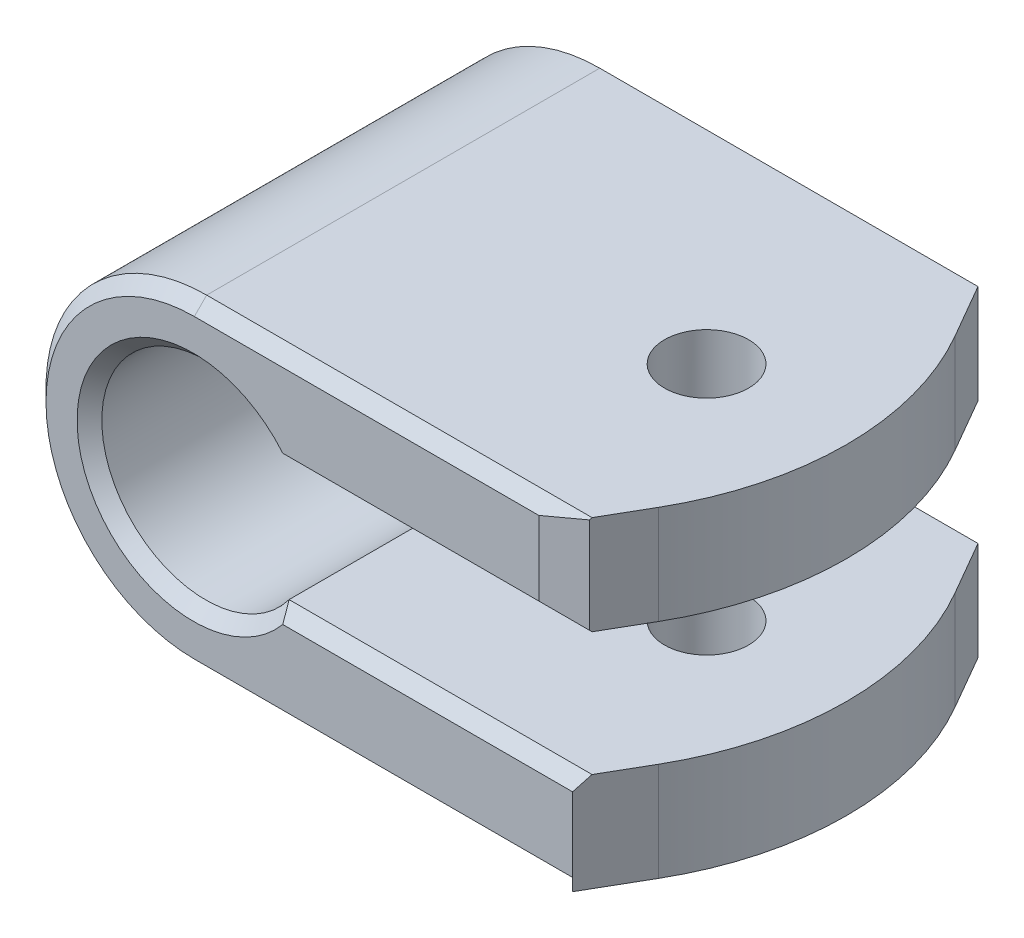
ISO-10303-21;
HEADER;
FILE_DESCRIPTION(('STEP AP214'),'2;1');
FILE_NAME('part.step','',(''),(''),'','','');
FILE_SCHEMA(('AUTOMOTIVE_DESIGN { 1 0 10303 214 1 1 1 1 }'));
ENDSEC;
DATA;
#1=APPLICATION_CONTEXT('core data for automotive mechanical design processes');
#2=APPLICATION_PROTOCOL_DEFINITION('international standard','automotive_design',2000,#1);
#3=PRODUCT_CONTEXT('',#1,'mechanical');
#4=PRODUCT('Part','Part','',(#3));
#5=PRODUCT_RELATED_PRODUCT_CATEGORY('part','',(#4));
#6=PRODUCT_DEFINITION_FORMATION('','',#4);
#7=PRODUCT_DEFINITION_CONTEXT('part definition',#1,'design');
#8=PRODUCT_DEFINITION('design','',#6,#7);
#9=PRODUCT_DEFINITION_SHAPE('','',#8);
#10=(LENGTH_UNIT() NAMED_UNIT(*) SI_UNIT(.MILLI.,.METRE.));
#11=(NAMED_UNIT(*) PLANE_ANGLE_UNIT() SI_UNIT($,.RADIAN.));
#12=(NAMED_UNIT(*) SI_UNIT($,.STERADIAN.) SOLID_ANGLE_UNIT());
#13=UNCERTAINTY_MEASURE_WITH_UNIT(LENGTH_MEASURE(1.E-05),#10,'distance_accuracy_value','');
#14=(GEOMETRIC_REPRESENTATION_CONTEXT(3) GLOBAL_UNCERTAINTY_ASSIGNED_CONTEXT((#13)) GLOBAL_UNIT_ASSIGNED_CONTEXT((#10,
#11,#12)) REPRESENTATION_CONTEXT('',''));
#15=CARTESIAN_POINT('',(0.,0.,0.));
#16=DIRECTION('',(0.,0.,1.));
#17=DIRECTION('',(1.,0.,0.));
#18=AXIS2_PLACEMENT_3D('',#15,#16,#17);
#19=CARTESIAN_POINT('',(7.20000000000028,1.4,-1.00613961606655E-13));
#20=DIRECTION('',(0.,-1.,0.));
#21=DIRECTION('',(1.,0.,0.));
#22=AXIS2_PLACEMENT_3D('',#19,#20,#21);
#23=PLANE('',#22);
#24=DIRECTION('',(0.500000292604391,0.,0.866025234849149));
#25=VECTOR('',#24,1.);
#26=CARTESIAN_POINT('',(15.4826863436423,1.4,-8.93894010313866));
#27=LINE('',#26,#25);
#28=CARTESIAN_POINT('',(22.5489306660471,1.4,3.30014453206585));
#29=VERTEX_POINT('',#28);
#30=CARTESIAN_POINT('',(25.3778646431267,1.4,8.19999808837436));
#31=VERTEX_POINT('',#30);
#32=EDGE_CURVE('E236',#29,#31,#27,.T.);
#33=ORIENTED_EDGE('',*,*,#32,.F.);
#34=DIRECTION('',(0.999999999999943,0.,-3.37870480659489E-07));
#35=VECTOR('',#34,1.);
#36=CARTESIAN_POINT('',(1.11502399338512E-06,1.4,3.30015215068352));
#37=LINE('',#36,#35);
#38=CARTESIAN_POINT('',(16.8910660229206,1.4,3.3001464436913));
#39=VERTEX_POINT('',#38);
#40=EDGE_CURVE('E232',#39,#29,#37,.T.);
#41=ORIENTED_EDGE('',*,*,#40,.F.);
#42=DIRECTION('',(0.499999707395552,0.,-0.86602557271963));
#43=VECTOR('',#42,1.);
#44=CARTESIAN_POINT('',(14.0973092303015,1.4,8.13907892821232));
#45=LINE('',#44,#43);
#46=CARTESIAN_POINT('',(14.0621353568735,1.4,8.20000191162539));
#47=VERTEX_POINT('',#46);
#48=EDGE_CURVE('E216',#47,#39,#45,.T.);
#49=ORIENTED_EDGE('',*,*,#48,.F.);
#50=DIRECTION('',(-0.500000292604391,0.,-0.866025234849149));
#51=VECTOR('',#50,1.);
#52=CARTESIAN_POINT('',(6.99589103446863,1.4,-4.03908272357912));
#53=LINE('',#52,#51);
#54=CARTESIAN_POINT('',(16.891069333953,1.4,13.099855467934));
#55=VERTEX_POINT('',#54);
#56=EDGE_CURVE('E250',#55,#47,#53,.T.);
#57=ORIENTED_EDGE('',*,*,#56,.F.);
#58=DIRECTION('',(-0.999999999999943,0.,3.37870480659488E-07));
#59=VECTOR('',#58,1.);
#60=CARTESIAN_POINT('',(4.42605639172933E-06,1.4,13.0998611749263));
#61=LINE('',#60,#59);
#62=CARTESIAN_POINT('',(22.5489339770795,1.4,13.0998535563086));
#63=VERTEX_POINT('',#62);
#64=EDGE_CURVE('E247',#63,#55,#61,.T.);
#65=ORIENTED_EDGE('',*,*,#64,.F.);
#66=DIRECTION('',(-0.499999707395552,0.,0.86602557271963));
#67=VECTOR('',#66,1.);
#68=CARTESIAN_POINT('',(22.5841078505075,1.4,13.0389305728955));
#69=LINE('',#68,#67);
#70=EDGE_CURVE('E244',#31,#63,#69,.T.);
#71=ORIENTED_EDGE('',*,*,#70,.F.);
#72=CARTESIAN_POINT('',(13.3778646431267,1.4,8.19999808837445));
#73=DIRECTION('',(0.,-1.,0.));
#74=DIRECTION('',(1.,0.,0.));
#75=AXIS2_PLACEMENT_3D('',#72,#73,#74);
#76=CIRCLE('',#75,12.);
#77=CARTESIAN_POINT('',(23.7701694885399,1.39999999999967,14.1999980883743));
#78=VERTEX_POINT('',#77);
#79=EDGE_CURVE('E854',#31,#78,#76,.T.);
#80=ORIENTED_EDGE('',*,*,#79,.T.);
#81=DIRECTION('',(0.499999999999994,0.,-0.866025403784442));
#82=VECTOR('',#81,1.);
#83=CARTESIAN_POINT('',(22.5000000000002,1.39999999999969,16.399996176749));
#84=LINE('',#83,#82);
#85=CARTESIAN_POINT('',(22.5000000000002,1.39999999999969,16.399996176749));
#86=VERTEX_POINT('',#85);
#87=EDGE_CURVE('E280',#86,#78,#84,.T.);
#88=ORIENTED_EDGE('',*,*,#87,.F.);
#89=DIRECTION('',(0.,0.,1.));
#90=VECTOR('',#89,1.);
#91=CARTESIAN_POINT('',(22.5000000000002,1.39999999999969,-1.00613961606655E-13));
#92=LINE('',#91,#90);
#93=CARTESIAN_POINT('',(22.5000000000003,1.4,15.899996176749));
#94=VERTEX_POINT('',#93);
#95=EDGE_CURVE('E276',#94,#86,#92,.T.);
#96=ORIENTED_EDGE('',*,*,#95,.F.);
#97=DIRECTION('',(-1.,0.,0.));
#98=VECTOR('',#97,1.);
#99=CARTESIAN_POINT('',(7.20000000000028,1.4,15.899996176749));
#100=LINE('',#99,#98);
#101=CARTESIAN_POINT('',(7.20000000000028,1.4,15.899996176749));
#102=VERTEX_POINT('',#101);
#103=EDGE_CURVE('E378',#94,#102,#100,.T.);
#104=ORIENTED_EDGE('',*,*,#103,.T.);
#105=DIRECTION('',(0.,0.,1.));
#106=VECTOR('',#105,1.);
#107=CARTESIAN_POINT('',(7.20000000000028,1.4,-1.00613961606655E-13));
#108=LINE('',#107,#106);
#109=CARTESIAN_POINT('',(7.20000000000028,1.4,-1.00613961606655E-13));
#110=VERTEX_POINT('',#109);
#111=EDGE_CURVE('E328',#110,#102,#108,.T.);
#112=ORIENTED_EDGE('',*,*,#111,.F.);
#113=DIRECTION('',(1.,0.,0.));
#114=VECTOR('',#113,1.);
#115=CARTESIAN_POINT('',(7.20000000000028,1.4,-1.00613961606655E-13));
#116=LINE('',#115,#114);
#117=CARTESIAN_POINT('',(22.5000000000003,1.4,-1.00613961606655E-13));
#118=VERTEX_POINT('',#117);
#119=EDGE_CURVE('E318',#110,#118,#116,.T.);
#120=ORIENTED_EDGE('',*,*,#119,.T.);
#121=DIRECTION('',(-0.499999999999994,0.,-0.866025403784442));
#122=VECTOR('',#121,1.);
#123=CARTESIAN_POINT('',(27.2342711036776,1.39999999999962,8.19999808837445));
#124=LINE('',#123,#122);
#125=CARTESIAN_POINT('',(23.7701694885399,1.39999999999967,2.19999808837456));
#126=VERTEX_POINT('',#125);
#127=EDGE_CURVE('E275',#126,#118,#124,.T.);
#128=ORIENTED_EDGE('',*,*,#127,.F.);
#129=EDGE_CURVE('E830',#126,#31,#76,.T.);
#130=ORIENTED_EDGE('',*,*,#129,.T.);
#131=EDGE_LOOP('',(#33,#41,#49,#57,#65,#71,#80,#88,#96,#104,#112,#120,#128,#130));
#132=FACE_BOUND('',#131,.T.);
#133=ADVANCED_FACE('F34',(#132),#23,.T.);
#134=CARTESIAN_POINT('',(27.2342711036777,-6.66965721625649,8.19999808837445));
#135=DIRECTION('',(0.866025403784442,0.,-0.499999999999994));
#136=DIRECTION('',(-0.499999999999995,0.,-0.866025403784442));
#137=AXIS2_PLACEMENT_3D('',#134,#135,#136);
#138=PLANE('',#137);
#139=DIRECTION('',(0.499999999999995,0.,0.866025403784442));
#140=VECTOR('',#139,1.);
#141=CARTESIAN_POINT('',(27.2342711036777,10.4,8.19999808837456));
#142=LINE('',#141,#140);
#143=CARTESIAN_POINT('',(22.5000000000003,10.4000000000001,-1.00613961606655E-13));
#144=VERTEX_POINT('',#143);
#145=CARTESIAN_POINT('',(23.77016948854,10.4000000000001,2.19999808837452));
#146=VERTEX_POINT('',#145);
#147=EDGE_CURVE('E268',#144,#146,#142,.T.);
#148=ORIENTED_EDGE('',*,*,#147,.F.);
#149=DIRECTION('',(0.,1.,0.));
#150=VECTOR('',#149,1.);
#151=CARTESIAN_POINT('',(22.5000000000003,1.4,-1.00613961606655E-13));
#152=LINE('',#151,#150);
#153=CARTESIAN_POINT('',(22.5000000000003,14.4,-1.00613961606655E-13));
#154=VERTEX_POINT('',#153);
#155=EDGE_CURVE('E321',#144,#154,#152,.T.);
#156=ORIENTED_EDGE('',*,*,#155,.T.);
#157=DIRECTION('',(-0.499999999999994,0.,-0.866025403784442));
#158=VECTOR('',#157,1.);
#159=CARTESIAN_POINT('',(27.2342711036777,14.4,8.19999808837445));
#160=LINE('',#159,#158);
#161=CARTESIAN_POINT('',(23.77016948854,14.4,2.19999808837452));
#162=VERTEX_POINT('',#161);
#163=EDGE_CURVE('E286',#162,#154,#160,.T.);
#164=ORIENTED_EDGE('',*,*,#163,.F.);
#165=DIRECTION('',(0.,1.,0.));
#166=VECTOR('',#165,1.);
#167=CARTESIAN_POINT('',(23.77016948854,-6.66965721625649,2.19999808837452));
#168=LINE('',#167,#166);
#169=EDGE_CURVE('E343',#162,#146,#168,.F.);
#170=ORIENTED_EDGE('',*,*,#169,.T.);
#171=EDGE_LOOP('',(#148,#156,#164,#170));
#172=FACE_BOUND('',#171,.T.);
#173=ADVANCED_FACE('F441',(#172),#138,.T.);
#174=CARTESIAN_POINT('',(22.5000000000003,-6.66965721625649,16.399996176749));
#175=DIRECTION('',(0.866025403784442,0.,0.499999999999994));
#176=DIRECTION('',(0.499999999999995,0.,-0.866025403784442));
#177=AXIS2_PLACEMENT_3D('',#174,#175,#176);
#178=PLANE('',#177);
#179=DIRECTION('',(-0.499999999999995,0.,0.866025403784442));
#180=VECTOR('',#179,1.);
#181=CARTESIAN_POINT('',(22.5000000000003,10.4000000000001,16.3999961767489));
#182=LINE('',#181,#180);
#183=CARTESIAN_POINT('',(23.77016948854,10.4000000000001,14.1999980883744));
#184=VERTEX_POINT('',#183);
#185=CARTESIAN_POINT('',(22.7886751345951,10.4000000000001,15.899996176749));
#186=VERTEX_POINT('',#185);
#187=EDGE_CURVE('E270',#184,#186,#182,.T.);
#188=ORIENTED_EDGE('',*,*,#187,.F.);
#189=DIRECTION('',(0.,1.,0.));
#190=VECTOR('',#189,1.);
#191=CARTESIAN_POINT('',(23.77016948854,-6.66965721625649,14.1999980883744));
#192=LINE('',#191,#190);
#193=CARTESIAN_POINT('',(23.77016948854,14.4,14.1999980883744));
#194=VERTEX_POINT('',#193);
#195=EDGE_CURVE('E334',#184,#194,#192,.T.);
#196=ORIENTED_EDGE('',*,*,#195,.T.);
#197=DIRECTION('',(0.499999999999994,0.,-0.866025403784442));
#198=VECTOR('',#197,1.);
#199=CARTESIAN_POINT('',(22.5000000000003,14.4,16.399996176749));
#200=LINE('',#199,#198);
#201=CARTESIAN_POINT('',(22.7886751345951,14.4,15.899996176749));
#202=VERTEX_POINT('',#201);
#203=EDGE_CURVE('E288',#202,#194,#200,.T.);
#204=ORIENTED_EDGE('',*,*,#203,.F.);
#205=DIRECTION('',(0.377964473009222,0.654653670707979,-0.654653670707979));
#206=VECTOR('',#205,1.);
#207=CARTESIAN_POINT('',(17.4103298010243,5.08443262160433,25.2155635551447));
#208=LINE('',#207,#206);
#209=CARTESIAN_POINT('',(22.7500000000003,14.3330127018922,15.9669834748568));
#210=VERTEX_POINT('',#209);
#211=EDGE_CURVE('E373',#202,#210,#208,.F.);
#212=ORIENTED_EDGE('',*,*,#211,.T.);
#213=DIRECTION('',(0.,-1.,0.));
#214=VECTOR('',#213,1.);
#215=CARTESIAN_POINT('',(22.7500000000003,-6.66965721625649,15.9669834748568));
#216=LINE('',#215,#214);
#217=CARTESIAN_POINT('',(22.7500000000003,10.4669872981079,15.9669834748568));
#218=VERTEX_POINT('',#217);
#219=EDGE_CURVE('E371',#210,#218,#216,.T.);
#220=ORIENTED_EDGE('',*,*,#219,.T.);
#221=DIRECTION('',(0.377964473009223,-0.654653670707978,-0.654653670707979));
#222=VECTOR('',#221,1.);
#223=CARTESIAN_POINT('',(26.8473627100182,3.37014690731867,8.87014308406759));
#224=LINE('',#223,#222);
#225=EDGE_CURVE('E368',#218,#186,#224,.T.);
#226=ORIENTED_EDGE('',*,*,#225,.T.);
#227=EDGE_LOOP('',(#188,#196,#204,#212,#220,#226));
#228=FACE_BOUND('',#227,.T.);
#229=ADVANCED_FACE('F447',(#228),#178,.T.);
#230=CARTESIAN_POINT('',(10.53268810596,10.4000000000001,16.399996176749));
#231=DIRECTION('',(0.,1.,0.));
#232=DIRECTION('',(-1.,0.,0.));
#233=AXIS2_PLACEMENT_3D('',#230,#231,#232);
#234=PLANE('',#233);
#235=CARTESIAN_POINT('',(19.7200000000002,10.4000000000001,8.19999999999995));
#236=DIRECTION('',(0.,1.,0.));
#237=DIRECTION('',(-1.,0.,0.));
#238=AXIS2_PLACEMENT_3D('',#235,#236,#237);
#239=CIRCLE('',#238,1.7);
#240=CARTESIAN_POINT('',(18.0200000000002,10.4000000000001,8.19999999999995));
#241=VERTEX_POINT('',#240);
#242=EDGE_CURVE('E298',#241,#241,#239,.T.);
#243=ORIENTED_EDGE('',*,*,#242,.T.);
#244=EDGE_LOOP('',(#243));
#245=FACE_BOUND('',#244,.T.);
#246=DIRECTION('',(1.,0.,0.));
#247=VECTOR('',#246,1.);
#248=CARTESIAN_POINT('',(10.53268810596,10.4000000000001,0.));
#249=LINE('',#248,#247);
#250=CARTESIAN_POINT('',(10.53268810596,10.4000000000001,0.));
#251=VERTEX_POINT('',#250);
#252=EDGE_CURVE('E301',#251,#144,#249,.T.);
#253=ORIENTED_EDGE('',*,*,#252,.T.);
#254=ORIENTED_EDGE('',*,*,#147,.T.);
#255=CARTESIAN_POINT('',(13.3778646431267,10.4000000000001,8.19999808837445));
#256=DIRECTION('',(0.,1.,0.));
#257=DIRECTION('',(-1.,0.,0.));
#258=AXIS2_PLACEMENT_3D('',#255,#256,#257);
#259=CIRCLE('',#258,12.);
#260=EDGE_CURVE('E346',#146,#184,#259,.F.);
#261=ORIENTED_EDGE('',*,*,#260,.T.);
#262=ORIENTED_EDGE('',*,*,#187,.T.);
#263=DIRECTION('',(-1.,0.,0.));
#264=VECTOR('',#263,1.);
#265=CARTESIAN_POINT('',(11.1377304482492,10.4000000000001,15.899996176749));
#266=LINE('',#265,#264);
#267=CARTESIAN_POINT('',(10.53268810596,10.4000000000001,15.899996176749));
#268=VERTEX_POINT('',#267);
#269=EDGE_CURVE('E384',#186,#268,#266,.T.);
#270=ORIENTED_EDGE('',*,*,#269,.T.);
#271=DIRECTION('',(0.,0.,-1.));
#272=VECTOR('',#271,1.);
#273=CARTESIAN_POINT('',(10.53268810596,10.4000000000001,16.399996176749));
#274=LINE('',#273,#272);
#275=EDGE_CURVE('E311',#268,#251,#274,.T.);
#276=ORIENTED_EDGE('',*,*,#275,.T.);
#277=EDGE_LOOP('',(#253,#254,#261,#262,#270,#276));
#278=FACE_BOUND('',#277,.T.);
#279=ADVANCED_FACE('F469',(#245,#278),#234,.F.);
#280=CARTESIAN_POINT('',(7.20000000000028,7.9,-1.00613961606655E-13));
#281=DIRECTION('',(0.,0.,1.));
#282=DIRECTION('',(1.,0.,0.));
#283=AXIS2_PLACEMENT_3D('',#280,#281,#282);
#284=CYLINDRICAL_SURFACE('',#283,6.5);
#285=ORIENTED_EDGE('',*,*,#111,.T.);
#286=CARTESIAN_POINT('',(7.20000000000028,7.9,15.899996176749));
#287=DIRECTION('',(0.,0.,1.));
#288=DIRECTION('',(1.,0.,0.));
#289=AXIS2_PLACEMENT_3D('',#286,#287,#288);
#290=CIRCLE('',#289,6.5);
#291=CARTESIAN_POINT('',(7.20000000000028,14.4,15.899996176749));
#292=VERTEX_POINT('',#291);
#293=EDGE_CURVE('E380',#102,#292,#290,.F.);
#294=ORIENTED_EDGE('',*,*,#293,.T.);
#295=DIRECTION('',(0.,0.,1.));
#296=VECTOR('',#295,1.);
#297=CARTESIAN_POINT('',(7.20000000000028,14.4,-1.00613961606655E-13));
#298=LINE('',#297,#296);
#299=CARTESIAN_POINT('',(7.20000000000028,14.4,-1.00613961606655E-13));
#300=VERTEX_POINT('',#299);
#301=EDGE_CURVE('E331',#300,#292,#298,.T.);
#302=ORIENTED_EDGE('',*,*,#301,.F.);
#303=CARTESIAN_POINT('',(7.20000000000028,7.9,-1.00613961606655E-13));
#304=DIRECTION('',(0.,0.,1.));
#305=DIRECTION('',(1.,0.,0.));
#306=AXIS2_PLACEMENT_3D('',#303,#304,#305);
#307=CIRCLE('',#306,6.5);
#308=EDGE_CURVE('E315',#300,#110,#307,.T.);
#309=ORIENTED_EDGE('',*,*,#308,.T.);
#310=EDGE_LOOP('',(#285,#294,#302,#309));
#311=FACE_BOUND('',#310,.T.);
#312=ADVANCED_FACE('F464',(#311),#284,.T.);
#313=CARTESIAN_POINT('',(22.5000000000003,14.4,-1.00613961606655E-13));
#314=DIRECTION('',(0.,1.,0.));
#315=DIRECTION('',(0.,0.,1.));
#316=AXIS2_PLACEMENT_3D('',#313,#314,#315);
#317=PLANE('',#316);
#318=CARTESIAN_POINT('',(19.7200000000002,14.4,8.19999999999995));
#319=DIRECTION('',(0.,-1.,0.));
#320=DIRECTION('',(1.,0.,0.));
#321=AXIS2_PLACEMENT_3D('',#318,#319,#320);
#322=CIRCLE('',#321,1.7);
#323=CARTESIAN_POINT('',(21.4200000000002,14.4,8.19999999999995));
#324=VERTEX_POINT('',#323);
#325=EDGE_CURVE('E294',#324,#324,#322,.T.);
#326=ORIENTED_EDGE('',*,*,#325,.T.);
#327=EDGE_LOOP('',(#326));
#328=FACE_BOUND('',#327,.T.);
#329=ORIENTED_EDGE('',*,*,#301,.T.);
#330=DIRECTION('',(1.,0.,0.));
#331=VECTOR('',#330,1.);
#332=CARTESIAN_POINT('',(22.5000000000003,14.4,15.899996176749));
#333=LINE('',#332,#331);
#334=EDGE_CURVE('E382',#292,#202,#333,.T.);
#335=ORIENTED_EDGE('',*,*,#334,.T.);
#336=ORIENTED_EDGE('',*,*,#203,.T.);
#337=CARTESIAN_POINT('',(13.3778646431267,14.4,8.19999808837445));
#338=DIRECTION('',(0.,1.,0.));
#339=DIRECTION('',(0.,0.,1.));
#340=AXIS2_PLACEMENT_3D('',#337,#338,#339);
#341=CIRCLE('',#340,12.);
#342=EDGE_CURVE('E341',#194,#162,#341,.T.);
#343=ORIENTED_EDGE('',*,*,#342,.T.);
#344=ORIENTED_EDGE('',*,*,#163,.T.);
#345=DIRECTION('',(-1.,0.,0.));
#346=VECTOR('',#345,1.);
#347=CARTESIAN_POINT('',(22.5000000000003,14.4,-1.00613961606655E-13));
#348=LINE('',#347,#346);
#349=EDGE_CURVE('E325',#154,#300,#348,.T.);
#350=ORIENTED_EDGE('',*,*,#349,.T.);
#351=EDGE_LOOP('',(#329,#335,#336,#343,#344,#350));
#352=FACE_BOUND('',#351,.T.);
#353=ADVANCED_FACE('F456',(#328,#352),#317,.T.);
#354=DIRECTION('',(-1.,0.,0.));
#355=VECTOR('',#354,1.);
#356=CARTESIAN_POINT('',(0.,1.4,10.9712812921102));
#357=LINE('',#356,#355);
#358=CARTESIAN_POINT('',(21.3200000000001,1.4,10.9712812921102));
#359=VERTEX_POINT('',#358);
#360=CARTESIAN_POINT('',(18.1200000000001,1.4,10.9712812921101));
#361=VERTEX_POINT('',#360);
#362=EDGE_CURVE('E211',#359,#361,#357,.T.);
#363=ORIENTED_EDGE('',*,*,#362,.T.);
#364=DIRECTION('',(-0.5,0.,-0.866025403784439));
#365=VECTOR('',#364,1.);
#366=CARTESIAN_POINT('',(8.83929584448388,1.4,-5.10336983525951));
#367=LINE('',#366,#365);
#368=CARTESIAN_POINT('',(16.5200000000001,1.4,8.19999999999994));
#369=VERTEX_POINT('',#368);
#370=EDGE_CURVE('E224',#361,#369,#367,.T.);
#371=ORIENTED_EDGE('',*,*,#370,.T.);
#372=DIRECTION('',(0.500000000000001,0.,-0.866025403784438));
#373=VECTOR('',#372,1.);
#374=CARTESIAN_POINT('',(15.9407041555162,1.4,9.20336983525949));
#375=LINE('',#374,#373);
#376=CARTESIAN_POINT('',(18.1200000000001,1.4,5.42871870788973));
#377=VERTEX_POINT('',#376);
#378=EDGE_CURVE('E233',#369,#377,#375,.T.);
#379=ORIENTED_EDGE('',*,*,#378,.T.);
#380=DIRECTION('',(1.,0.,0.));
#381=VECTOR('',#380,1.);
#382=CARTESIAN_POINT('',(0.,1.4,5.42871870788973));
#383=LINE('',#382,#381);
#384=CARTESIAN_POINT('',(21.3200000000001,1.4,5.42871870788973));
#385=VERTEX_POINT('',#384);
#386=EDGE_CURVE('E238',#377,#385,#383,.T.);
#387=ORIENTED_EDGE('',*,*,#386,.T.);
#388=DIRECTION('',(0.5,0.,0.866025403784439));
#389=VECTOR('',#388,1.);
#390=CARTESIAN_POINT('',(13.6392958444839,1.4,-7.87465112736971));
#391=LINE('',#390,#389);
#392=CARTESIAN_POINT('',(22.9200000000001,1.4,8.19999999999994));
#393=VERTEX_POINT('',#392);
#394=EDGE_CURVE('E896',#385,#393,#391,.T.);
#395=ORIENTED_EDGE('',*,*,#394,.T.);
#396=DIRECTION('',(-0.500000000000001,0.,0.866025403784438));
#397=VECTOR('',#396,1.);
#398=CARTESIAN_POINT('',(20.7407041555162,1.4,11.9746511273697));
#399=LINE('',#398,#397);
#400=EDGE_CURVE('E228',#393,#359,#399,.T.);
#401=ORIENTED_EDGE('',*,*,#400,.T.);
#402=EDGE_LOOP('',(#363,#371,#379,#387,#395,#401));
#403=FACE_BOUND('',#402,.T.);
#404=CARTESIAN_POINT('',(19.7200000000001,1.39999999999973,8.19999999999995));
#405=DIRECTION('',(0.,-1.,0.));
#406=DIRECTION('',(1.,0.,0.));
#407=AXIS2_PLACEMENT_3D('',#404,#405,#406);
#408=CIRCLE('',#407,1.7);
#409=CARTESIAN_POINT('',(21.4200000000001,1.3999999999997,8.19999999999995));
#410=VERTEX_POINT('',#409);
#411=EDGE_CURVE('E291',#410,#410,#408,.T.);
#412=ORIENTED_EDGE('',*,*,#411,.F.);
#413=EDGE_LOOP('',(#412));
#414=FACE_BOUND('',#413,.T.);
#415=ADVANCED_FACE('F221',(#403,#414),#23,.T.);
#416=CARTESIAN_POINT('',(7.20000000000028,7.9,-1.00613961606655E-13));
#417=DIRECTION('',(0.,0.,1.));
#418=DIRECTION('',(1.,0.,0.));
#419=AXIS2_PLACEMENT_3D('',#416,#417,#418);
#420=PLANE('',#419);
#421=ORIENTED_EDGE('',*,*,#155,.F.);
#422=ORIENTED_EDGE('',*,*,#252,.F.);
#423=CARTESIAN_POINT('',(7.15778069982282,7.9,0.));
#424=DIRECTION('',(0.,0.,-1.));
#425=DIRECTION('',(1.,0.,0.));
#426=AXIS2_PLACEMENT_3D('',#423,#424,#425);
#427=CIRCLE('',#426,4.2);
#428=CARTESIAN_POINT('',(10.53268810596,5.39999999999992,0.));
#429=VERTEX_POINT('',#428);
#430=EDGE_CURVE('E307',#429,#251,#427,.T.);
#431=ORIENTED_EDGE('',*,*,#430,.F.);
#432=DIRECTION('',(-1.,0.,0.));
#433=VECTOR('',#432,1.);
#434=CARTESIAN_POINT('',(22.5,5.39999999999992,0.));
#435=LINE('',#434,#433);
#436=CARTESIAN_POINT('',(22.5000000000002,5.39999999999992,0.));
#437=VERTEX_POINT('',#436);
#438=EDGE_CURVE('E304',#437,#429,#435,.T.);
#439=ORIENTED_EDGE('',*,*,#438,.F.);
#440=EDGE_CURVE('E322',#118,#437,#152,.T.);
#441=ORIENTED_EDGE('',*,*,#440,.F.);
#442=ORIENTED_EDGE('',*,*,#119,.F.);
#443=ORIENTED_EDGE('',*,*,#308,.F.);
#444=ORIENTED_EDGE('',*,*,#349,.F.);
#445=EDGE_LOOP('',(#421,#422,#431,#439,#441,#442,#443,#444));
#446=FACE_BOUND('',#445,.T.);
#447=ADVANCED_FACE('F455',(#446),#420,.F.);
#448=CARTESIAN_POINT('',(7.20000000000028,7.9,16.399996176749));
#449=DIRECTION('',(0.,0.,1.));
#450=DIRECTION('',(1.,0.,0.));
#451=AXIS2_PLACEMENT_3D('',#448,#449,#450);
#452=PLANE('',#451);
#453=CARTESIAN_POINT('',(7.20000000000028,7.9,16.399996176749));
#454=DIRECTION('',(0.,0.,1.));
#455=DIRECTION('',(1.,0.,0.));
#456=AXIS2_PLACEMENT_3D('',#453,#454,#455);
#457=CIRCLE('',#456,6.);
#458=CARTESIAN_POINT('',(7.20000000000028,13.9,16.399996176749));
#459=VERTEX_POINT('',#458);
#460=CARTESIAN_POINT('',(7.20000000000028,1.9,16.399996176749));
#461=VERTEX_POINT('',#460);
#462=EDGE_CURVE('E364',#459,#461,#457,.T.);
#463=ORIENTED_EDGE('',*,*,#462,.T.);
#464=DIRECTION('',(1.,0.,0.));
#465=VECTOR('',#464,1.);
#466=CARTESIAN_POINT('',(7.20000000000028,1.9,16.399996176749));
#467=LINE('',#466,#465);
#468=CARTESIAN_POINT('',(22.5000000000003,1.9,16.399996176749));
#469=VERTEX_POINT('',#468);
#470=EDGE_CURVE('E366',#461,#469,#467,.T.);
#471=ORIENTED_EDGE('',*,*,#470,.T.);
#472=DIRECTION('',(0.,1.,0.));
#473=VECTOR('',#472,1.);
#474=CARTESIAN_POINT('',(22.5000000000003,1.4,16.399996176749));
#475=LINE('',#474,#473);
#476=CARTESIAN_POINT('',(22.5000000000002,4.89999999999992,16.399996176749));
#477=VERTEX_POINT('',#476);
#478=EDGE_CURVE('E313',#469,#477,#475,.T.);
#479=ORIENTED_EDGE('',*,*,#478,.T.);
#480=DIRECTION('',(-1.,0.,0.));
#481=VECTOR('',#480,1.);
#482=CARTESIAN_POINT('',(11.1377304482492,4.89999999999992,16.399996176749));
#483=LINE('',#482,#481);
#484=CARTESIAN_POINT('',(10.7757912028479,4.89999999999992,16.399996176749));
#485=VERTEX_POINT('',#484);
#486=EDGE_CURVE('E354',#477,#485,#483,.T.);
#487=ORIENTED_EDGE('',*,*,#486,.T.);
#488=CARTESIAN_POINT('',(7.15778069982282,7.9,16.399996176749));
#489=DIRECTION('',(0.,0.,1.));
#490=DIRECTION('',(1.,0.,0.));
#491=AXIS2_PLACEMENT_3D('',#488,#489,#490);
#492=CIRCLE('',#491,4.7);
#493=CARTESIAN_POINT('',(10.7757912028479,10.9000000000001,16.399996176749));
#494=VERTEX_POINT('',#493);
#495=EDGE_CURVE('E348',#485,#494,#492,.F.);
#496=ORIENTED_EDGE('',*,*,#495,.T.);
#497=DIRECTION('',(1.,0.,0.));
#498=VECTOR('',#497,1.);
#499=CARTESIAN_POINT('',(22.5,10.9000000000001,16.399996176749));
#500=LINE('',#499,#498);
#501=CARTESIAN_POINT('',(21.1339745962159,10.9000000000001,16.399996176749));
#502=VERTEX_POINT('',#501);
#503=EDGE_CURVE('E357',#494,#502,#500,.T.);
#504=ORIENTED_EDGE('',*,*,#503,.T.);
#505=DIRECTION('',(0.,1.,0.));
#506=VECTOR('',#505,1.);
#507=CARTESIAN_POINT('',(21.1339745962159,7.9,16.399996176749));
#508=LINE('',#507,#506);
#509=CARTESIAN_POINT('',(21.1339745962159,13.9,16.399996176749));
#510=VERTEX_POINT('',#509);
#511=EDGE_CURVE('E359',#502,#510,#508,.T.);
#512=ORIENTED_EDGE('',*,*,#511,.T.);
#513=DIRECTION('',(-1.,0.,0.));
#514=VECTOR('',#513,1.);
#515=CARTESIAN_POINT('',(7.20000000000028,13.9,16.399996176749));
#516=LINE('',#515,#514);
#517=EDGE_CURVE('E362',#510,#459,#516,.T.);
#518=ORIENTED_EDGE('',*,*,#517,.T.);
#519=EDGE_LOOP('',(#463,#471,#479,#487,#496,#504,#512,#518));
#520=FACE_BOUND('',#519,.T.);
#521=ADVANCED_FACE('F461',(#520),#452,.T.);
#522=CARTESIAN_POINT('',(7.15778069982282,7.9,16.399996176749));
#523=DIRECTION('',(0.,0.,-1.));
#524=DIRECTION('',(-1.,0.,0.));
#525=AXIS2_PLACEMENT_3D('',#522,#523,#524);
#526=CYLINDRICAL_SURFACE('',#525,4.2);
#527=ORIENTED_EDGE('',*,*,#275,.F.);
#528=CARTESIAN_POINT('',(7.15778069982282,7.9,15.899996176749));
#529=DIRECTION('',(0.,0.,1.));
#530=DIRECTION('',(1.,0.,0.));
#531=AXIS2_PLACEMENT_3D('',#528,#529,#530);
#532=CIRCLE('',#531,4.2);
#533=CARTESIAN_POINT('',(10.53268810596,5.39999999999992,15.899996176749));
#534=VERTEX_POINT('',#533);
#535=EDGE_CURVE('E351',#268,#534,#532,.T.);
#536=ORIENTED_EDGE('',*,*,#535,.T.);
#537=DIRECTION('',(0.,0.,-1.));
#538=VECTOR('',#537,1.);
#539=CARTESIAN_POINT('',(10.53268810596,5.39999999999992,16.399996176749));
#540=LINE('',#539,#538);
#541=EDGE_CURVE('E310',#534,#429,#540,.T.);
#542=ORIENTED_EDGE('',*,*,#541,.T.);
#543=ORIENTED_EDGE('',*,*,#430,.T.);
#544=EDGE_LOOP('',(#527,#536,#542,#543));
#545=FACE_BOUND('',#544,.T.);
#546=ADVANCED_FACE('F474',(#545),#526,.F.);
#547=CARTESIAN_POINT('',(22.5,5.39999999999992,16.399996176749));
#548=DIRECTION('',(0.,-1.,0.));
#549=DIRECTION('',(0.,0.,-1.));
#550=AXIS2_PLACEMENT_3D('',#547,#548,#549);
#551=PLANE('',#550);
#552=CARTESIAN_POINT('',(19.7200000000001,5.39999999999992,8.19999999999995));
#553=DIRECTION('',(0.,-1.,0.));
#554=DIRECTION('',(0.,0.,-1.));
#555=AXIS2_PLACEMENT_3D('',#552,#553,#554);
#556=CIRCLE('',#555,1.7);
#557=CARTESIAN_POINT('',(19.7200000000001,5.39999999999992,6.49999999999995));
#558=VERTEX_POINT('',#557);
#559=EDGE_CURVE('E297',#558,#558,#556,.T.);
#560=ORIENTED_EDGE('',*,*,#559,.T.);
#561=EDGE_LOOP('',(#560));
#562=FACE_BOUND('',#561,.T.);
#563=ORIENTED_EDGE('',*,*,#541,.F.);
#564=DIRECTION('',(1.,0.,0.));
#565=VECTOR('',#564,1.);
#566=CARTESIAN_POINT('',(22.5,5.39999999999992,15.899996176749));
#567=LINE('',#566,#565);
#568=CARTESIAN_POINT('',(22.7886751345951,5.39999999999991,15.899996176749));
#569=VERTEX_POINT('',#568);
#570=EDGE_CURVE('E855',#534,#569,#567,.T.);
#571=ORIENTED_EDGE('',*,*,#570,.T.);
#572=DIRECTION('',(0.499999999999995,0.,-0.866025403784442));
#573=VECTOR('',#572,1.);
#574=CARTESIAN_POINT('',(22.5000000000003,5.39999999999992,16.3999961767489));
#575=LINE('',#574,#573);
#576=CARTESIAN_POINT('',(23.77016948854,5.39999999999987,14.1999980883744));
#577=VERTEX_POINT('',#576);
#578=EDGE_CURVE('E264',#569,#577,#575,.T.);
#579=ORIENTED_EDGE('',*,*,#578,.T.);
#580=CARTESIAN_POINT('',(13.3778646431267,5.40000000000005,8.19999808837445));
#581=DIRECTION('',(0.,-1.,0.));
#582=DIRECTION('',(1.,0.,0.));
#583=AXIS2_PLACEMENT_3D('',#580,#581,#582);
#584=CIRCLE('',#583,12.);
#585=CARTESIAN_POINT('',(23.77016948854,5.3999999999999,2.19999808837452));
#586=VERTEX_POINT('',#585);
#587=EDGE_CURVE('E860',#577,#586,#584,.F.);
#588=ORIENTED_EDGE('',*,*,#587,.T.);
#589=DIRECTION('',(-0.499999999999995,0.,-0.866025403784442));
#590=VECTOR('',#589,1.);
#591=CARTESIAN_POINT('',(27.2342711036777,5.39999999999985,8.19999808837453));
#592=LINE('',#591,#590);
#593=EDGE_CURVE('E266',#586,#437,#592,.T.);
#594=ORIENTED_EDGE('',*,*,#593,.T.);
#595=ORIENTED_EDGE('',*,*,#438,.T.);
#596=EDGE_LOOP('',(#563,#571,#579,#588,#594,#595));
#597=FACE_BOUND('',#596,.T.);
#598=ADVANCED_FACE('F480',(#562,#597),#551,.F.);
#599=CARTESIAN_POINT('',(19.7200000000002,14.4,8.19999999999995));
#600=DIRECTION('',(0.,-1.,0.));
#601=DIRECTION('',(1.,0.,0.));
#602=AXIS2_PLACEMENT_3D('',#599,#600,#601);
#603=CYLINDRICAL_SURFACE('',#602,1.7);
#604=ORIENTED_EDGE('',*,*,#411,.T.);
#605=EDGE_LOOP('',(#604));
#606=FACE_BOUND('',#605,.T.);
#607=ORIENTED_EDGE('',*,*,#559,.F.);
#608=EDGE_LOOP('',(#607));
#609=FACE_BOUND('',#608,.T.);
#610=ADVANCED_FACE('F483',(#606,#609),#603,.F.);
#611=ORIENTED_EDGE('',*,*,#325,.F.);
#612=EDGE_LOOP('',(#611));
#613=FACE_BOUND('',#612,.T.);
#614=ORIENTED_EDGE('',*,*,#242,.F.);
#615=EDGE_LOOP('',(#614));
#616=FACE_BOUND('',#615,.T.);
#617=ADVANCED_FACE('F488',(#613,#616),#603,.F.);
#618=ORIENTED_EDGE('',*,*,#593,.F.);
#619=DIRECTION('',(0.,-1.,0.));
#620=VECTOR('',#619,1.);
#621=CARTESIAN_POINT('',(23.77016948854,-6.66965721625649,2.19999808837452));
#622=LINE('',#621,#620);
#623=EDGE_CURVE('E827',#586,#126,#622,.T.);
#624=ORIENTED_EDGE('',*,*,#623,.T.);
#625=ORIENTED_EDGE('',*,*,#127,.T.);
#626=ORIENTED_EDGE('',*,*,#440,.T.);
#627=EDGE_LOOP('',(#618,#624,#625,#626));
#628=FACE_BOUND('',#627,.T.);
#629=ADVANCED_FACE('F450',(#628),#138,.T.);
#630=DIRECTION('',(0.377964473009225,0.654653670707972,-0.654653670707984));
#631=VECTOR('',#630,1.);
#632=CARTESIAN_POINT('',(19.6372522678986,-0.0584245212527429,21.3584206980018));
#633=LINE('',#632,#631);
#634=EDGE_CURVE('E272',#477,#569,#633,.T.);
#635=ORIENTED_EDGE('',*,*,#634,.F.);
#636=ORIENTED_EDGE('',*,*,#478,.F.);
#637=DIRECTION('',(0.,-1.,0.));
#638=VECTOR('',#637,1.);
#639=CARTESIAN_POINT('',(22.5000000000006,27.4696572162567,16.399996176749));
#640=LINE('',#639,#638);
#641=EDGE_CURVE('E279',#469,#86,#640,.T.);
#642=ORIENTED_EDGE('',*,*,#641,.T.);
#643=ORIENTED_EDGE('',*,*,#87,.T.);
#644=DIRECTION('',(0.,-1.,0.));
#645=VECTOR('',#644,1.);
#646=CARTESIAN_POINT('',(23.77016948854,-6.66965721625649,14.1999980883744));
#647=LINE('',#646,#645);
#648=EDGE_CURVE('E857',#78,#577,#647,.F.);
#649=ORIENTED_EDGE('',*,*,#648,.T.);
#650=ORIENTED_EDGE('',*,*,#578,.F.);
#651=EDGE_LOOP('',(#635,#636,#642,#643,#649,#650));
#652=FACE_BOUND('',#651,.T.);
#653=ADVANCED_FACE('F493',(#652),#178,.T.);
#654=CARTESIAN_POINT('',(13.3778646431267,-6.66965721625649,8.19999808837445));
#655=DIRECTION('',(0.,1.,0.));
#656=DIRECTION('',(0.,0.,1.));
#657=AXIS2_PLACEMENT_3D('',#654,#655,#656);
#658=CYLINDRICAL_SURFACE('',#657,12.);
#659=ORIENTED_EDGE('',*,*,#260,.F.);
#660=ORIENTED_EDGE('',*,*,#169,.F.);
#661=ORIENTED_EDGE('',*,*,#342,.F.);
#662=ORIENTED_EDGE('',*,*,#195,.F.);
#663=EDGE_LOOP('',(#659,#660,#661,#662));
#664=FACE_BOUND('',#663,.T.);
#665=ADVANCED_FACE('F497',(#664),#658,.T.);
#666=CARTESIAN_POINT('',(7.15778069982282,7.9,16.399996176749));
#667=DIRECTION('',(0.,0.,1.));
#668=DIRECTION('',(1.,0.,0.));
#669=AXIS2_PLACEMENT_3D('',#666,#667,#668);
#670=CONICAL_SURFACE('',#669,4.7,0.78539816339745);
#671=ORIENTED_EDGE('',*,*,#535,.F.);
#672=CARTESIAN_POINT('',(10.53268810596,10.4000000000001,15.899996176749));
#673=CARTESIAN_POINT('',(10.5744647090907,10.4830273138949,15.9830234906438));
#674=CARTESIAN_POINT('',(10.6156116335621,10.5662077046176,16.0662038813665));
#675=CARTESIAN_POINT('',(10.6966459951496,10.7328743722668,16.2328705490157));
#676=CARTESIAN_POINT('',(10.7365334363075,10.8163606482108,16.3163568249597));
#677=CARTESIAN_POINT('',(10.7757912028479,10.9000000000001,16.399996176749));
#678=B_SPLINE_CURVE_WITH_KNOTS('',3,(#672,#673,#674,#675,#676,#677),.UNSPECIFIED.,.F.,.F.,(4,2,
4),(0.,0.373870589582884,0.747739979259375),.UNSPECIFIED.);
#679=EDGE_CURVE('E393',#268,#494,#678,.T.);
#680=ORIENTED_EDGE('',*,*,#679,.T.);
#681=ORIENTED_EDGE('',*,*,#495,.F.);
#682=CARTESIAN_POINT('',(10.7757912028479,4.89999999999992,16.399996176749));
#683=CARTESIAN_POINT('',(10.7365334363072,4.98363935178913,16.3163568249598));
#684=CARTESIAN_POINT('',(10.6966459951494,5.06712562773314,16.2328705490158));
#685=CARTESIAN_POINT('',(10.6156116335624,5.2337922953825,16.0662038813664));
#686=CARTESIAN_POINT('',(10.5744647090915,5.31697268610529,15.9830234906436));
#687=CARTESIAN_POINT('',(10.5326881059616,5.40000000000028,15.8999961767486));
#688=B_SPLINE_CURVE_WITH_KNOTS('',3,(#682,#683,#684,#685,#686,#687),.UNSPECIFIED.,.F.,.F.,(4,2,
4),(0.,0.373869389676486,0.747739979259357),.UNSPECIFIED.);
#689=EDGE_CURVE('E386',#485,#534,#688,.T.);
#690=ORIENTED_EDGE('',*,*,#689,.T.);
#691=EDGE_LOOP('',(#671,#680,#681,#690));
#692=FACE_BOUND('',#691,.T.);
#693=ADVANCED_FACE('F399',(#692),#670,.F.);
#694=CARTESIAN_POINT('',(7.20000000000028,1.9,16.399996176749));
#695=DIRECTION('',(0.,0.707106781186547,-0.707106781186547));
#696=DIRECTION('',(1.,0.,0.));
#697=AXIS2_PLACEMENT_3D('',#694,#695,#696);
#698=PLANE('',#697);
#699=DIRECTION('',(0.,0.707106781186548,0.707106781186548));
#700=VECTOR('',#699,1.);
#701=CARTESIAN_POINT('',(22.5000000000003,-6.54999808837456,7.94999808837446));
#702=LINE('',#701,#700);
#703=EDGE_CURVE('E375',#469,#94,#702,.F.);
#704=ORIENTED_EDGE('',*,*,#703,.F.);
#705=ORIENTED_EDGE('',*,*,#470,.F.);
#706=DIRECTION('',(0.,0.707106781186547,0.707106781186547));
#707=VECTOR('',#706,1.);
#708=CARTESIAN_POINT('',(7.20000000000028,1.4,15.899996176749));
#709=LINE('',#708,#707);
#710=EDGE_CURVE('E289',#102,#461,#709,.T.);
#711=ORIENTED_EDGE('',*,*,#710,.F.);
#712=ORIENTED_EDGE('',*,*,#103,.F.);
#713=EDGE_LOOP('',(#704,#705,#711,#712));
#714=FACE_BOUND('',#713,.T.);
#715=ADVANCED_FACE('F411',(#714),#698,.F.);
#716=CARTESIAN_POINT('',(7.20000000000028,7.9,16.399996176749));
#717=DIRECTION('',(0.,0.,-1.));
#718=DIRECTION('',(-1.,0.,0.));
#719=AXIS2_PLACEMENT_3D('',#716,#717,#718);
#720=CONICAL_SURFACE('',#719,6.,0.785398163397447);
#721=ORIENTED_EDGE('',*,*,#710,.T.);
#722=ORIENTED_EDGE('',*,*,#462,.F.);
#723=DIRECTION('',(0.,-0.707106781186547,0.707106781186547));
#724=VECTOR('',#723,1.);
#725=CARTESIAN_POINT('',(7.20000000000028,14.4,15.899996176749));
#726=LINE('',#725,#724);
#727=EDGE_CURVE('E837',#292,#459,#726,.T.);
#728=ORIENTED_EDGE('',*,*,#727,.F.);
#729=ORIENTED_EDGE('',*,*,#293,.F.);
#730=EDGE_LOOP('',(#721,#722,#728,#729));
#731=FACE_BOUND('',#730,.T.);
#732=ADVANCED_FACE('F637',(#731),#720,.T.);
#733=CARTESIAN_POINT('',(7.20000000000028,10.9000000000001,16.399996176749));
#734=DIRECTION('',(0.,-0.707106781186548,0.707106781186547));
#735=DIRECTION('',(-1.,0.,0.));
#736=AXIS2_PLACEMENT_3D('',#733,#734,#735);
#737=PLANE('',#736);
#738=ORIENTED_EDGE('',*,*,#269,.F.);
#739=ORIENTED_EDGE('',*,*,#225,.F.);
#740=DIRECTION('',(0.935113126531027,-0.250562807085736,-0.250562807085737));
#741=VECTOR('',#740,1.);
#742=CARTESIAN_POINT('',(8.94959779138595,14.1647939251308,19.6647901018798));
#743=LINE('',#742,#741);
#744=EDGE_CURVE('E840',#502,#218,#743,.T.);
#745=ORIENTED_EDGE('',*,*,#744,.F.);
#746=ORIENTED_EDGE('',*,*,#503,.F.);
#747=ORIENTED_EDGE('',*,*,#679,.F.);
#748=EDGE_LOOP('',(#738,#739,#745,#746,#747));
#749=FACE_BOUND('',#748,.T.);
#750=ADVANCED_FACE('F629',(#749),#737,.T.);
#751=CARTESIAN_POINT('',(7.20000000000028,13.9,16.399996176749));
#752=DIRECTION('',(0.,-0.707106781186547,-0.707106781186547));
#753=DIRECTION('',(-1.,0.,0.));
#754=AXIS2_PLACEMENT_3D('',#751,#752,#753);
#755=PLANE('',#754);
#756=ORIENTED_EDGE('',*,*,#727,.T.);
#757=ORIENTED_EDGE('',*,*,#517,.F.);
#758=DIRECTION('',(0.935113126531027,0.250562807085737,-0.250562807085737));
#759=VECTOR('',#758,1.);
#760=CARTESIAN_POINT('',(8.94959779138595,10.6352060748693,19.6647901018798));
#761=LINE('',#760,#759);
#762=EDGE_CURVE('E283',#210,#510,#761,.F.);
#763=ORIENTED_EDGE('',*,*,#762,.F.);
#764=ORIENTED_EDGE('',*,*,#211,.F.);
#765=ORIENTED_EDGE('',*,*,#334,.F.);
#766=EDGE_LOOP('',(#756,#757,#763,#764,#765));
#767=FACE_BOUND('',#766,.T.);
#768=ADVANCED_FACE('F622',(#767),#755,.F.);
#769=CARTESIAN_POINT('',(21.1339745962159,7.9,16.399996176749));
#770=DIRECTION('',(-0.258819045102526,0.,-0.965925826289067));
#771=DIRECTION('',(0.,1.,0.));
#772=AXIS2_PLACEMENT_3D('',#769,#770,#771);
#773=PLANE('',#772);
#774=ORIENTED_EDGE('',*,*,#744,.T.);
#775=ORIENTED_EDGE('',*,*,#219,.F.);
#776=ORIENTED_EDGE('',*,*,#762,.T.);
#777=ORIENTED_EDGE('',*,*,#511,.F.);
#778=EDGE_LOOP('',(#774,#775,#776,#777));
#779=FACE_BOUND('',#778,.T.);
#780=ADVANCED_FACE('F409',(#779),#773,.F.);
#781=CARTESIAN_POINT('',(7.20000000000028,4.89999999999992,16.399996176749));
#782=DIRECTION('',(0.,0.70710678118655,0.707106781186545));
#783=DIRECTION('',(1.,0.,0.));
#784=AXIS2_PLACEMENT_3D('',#781,#782,#783);
#785=PLANE('',#784);
#786=ORIENTED_EDGE('',*,*,#486,.F.);
#787=ORIENTED_EDGE('',*,*,#634,.T.);
#788=ORIENTED_EDGE('',*,*,#570,.F.);
#789=ORIENTED_EDGE('',*,*,#689,.F.);
#790=EDGE_LOOP('',(#786,#787,#788,#789));
#791=FACE_BOUND('',#790,.T.);
#792=ADVANCED_FACE('F403',(#791),#785,.T.);
#793=CARTESIAN_POINT('',(22.5000000000006,27.4696572162567,-1.00613961606655E-13));
#794=DIRECTION('',(1.,0.,0.));
#795=DIRECTION('',(0.,1.,0.));
#796=AXIS2_PLACEMENT_3D('',#793,#794,#795);
#797=PLANE('',#796);
#798=ORIENTED_EDGE('',*,*,#703,.T.);
#799=ORIENTED_EDGE('',*,*,#95,.T.);
#800=ORIENTED_EDGE('',*,*,#641,.F.);
#801=EDGE_LOOP('',(#798,#799,#800));
#802=FACE_BOUND('',#801,.T.);
#803=ADVANCED_FACE('F408',(#802),#797,.F.);
#804=CARTESIAN_POINT('',(13.3778646431267,-6.66965721625649,8.19999808837445));
#805=DIRECTION('',(0.,-1.,0.));
#806=DIRECTION('',(0.,0.,-1.));
#807=AXIS2_PLACEMENT_3D('',#804,#805,#806);
#808=CYLINDRICAL_SURFACE('',#807,12.);
#809=ORIENTED_EDGE('',*,*,#623,.F.);
#810=ORIENTED_EDGE('',*,*,#587,.F.);
#811=ORIENTED_EDGE('',*,*,#648,.F.);
#812=ORIENTED_EDGE('',*,*,#79,.F.);
#813=ORIENTED_EDGE('',*,*,#129,.F.);
#814=EDGE_LOOP('',(#809,#810,#811,#812,#813));
#815=FACE_BOUND('',#814,.T.);
#816=ADVANCED_FACE('F413',(#815),#808,.T.);
#817=CARTESIAN_POINT('',(0.,-0.9,10.9712812921102));
#818=DIRECTION('',(0.,0.,-1.));
#819=DIRECTION('',(-1.,0.,0.));
#820=AXIS2_PLACEMENT_3D('',#817,#818,#819);
#821=PLANE('',#820);
#822=DIRECTION('',(0.,1.,0.));
#823=VECTOR('',#822,1.);
#824=CARTESIAN_POINT('',(21.3200000000001,-0.9,10.9712812921102));
#825=LINE('',#824,#823);
#826=CARTESIAN_POINT('',(21.3200000000001,-0.728573220011146,10.9712812921102));
#827=VERTEX_POINT('',#826);
#828=EDGE_CURVE('E262',#827,#359,#825,.T.);
#829=ORIENTED_EDGE('',*,*,#828,.F.);
#830=DIRECTION('',(-0.999999999999943,-3.37870480670769E-07,0.));
#831=VECTOR('',#830,1.);
#832=CARTESIAN_POINT('',(-5.79177973723327E-08,-0.728579882817466,10.9712812921102));
#833=LINE('',#832,#831);
#834=CARTESIAN_POINT('',(18.1200000000001,-0.728573220011146,10.9712812921101));
#835=VERTEX_POINT('',#834);
#836=EDGE_CURVE('E11',#827,#835,#833,.T.);
#837=ORIENTED_EDGE('',*,*,#836,.T.);
#838=DIRECTION('',(0.,1.,0.));
#839=VECTOR('',#838,1.);
#840=CARTESIAN_POINT('',(18.1200000000001,-0.9,10.9712812921101));
#841=LINE('',#840,#839);
#842=EDGE_CURVE('E208',#835,#361,#841,.T.);
#843=ORIENTED_EDGE('',*,*,#842,.T.);
#844=ORIENTED_EDGE('',*,*,#362,.F.);
#845=EDGE_LOOP('',(#829,#837,#843,#844));
#846=FACE_BOUND('',#845,.T.);
#847=ADVANCED_FACE('F210',(#846),#821,.T.);
#848=CARTESIAN_POINT('',(20.7407041555162,-0.9,11.9746511273697));
#849=DIRECTION('',(-0.866025403784438,0.,-0.500000000000001));
#850=DIRECTION('',(-0.500000000000001,0.,0.866025403784438));
#851=AXIS2_PLACEMENT_3D('',#848,#849,#850);
#852=PLANE('',#851);
#853=DIRECTION('',(0.,1.,0.));
#854=VECTOR('',#853,1.);
#855=CARTESIAN_POINT('',(22.9200000000001,-0.9,8.19999999999995));
#856=LINE('',#855,#854);
#857=CARTESIAN_POINT('',(22.9200000000001,-0.728573220011146,8.19999999999995));
#858=VERTEX_POINT('',#857);
#859=EDGE_CURVE('E260',#858,#393,#856,.T.);
#860=ORIENTED_EDGE('',*,*,#859,.F.);
#861=DIRECTION('',(-0.499999999999972,-3.37870481139695E-07,0.866025403784389));
#862=VECTOR('',#861,1.);
#863=CARTESIAN_POINT('',(20.7407041265563,-0.728574152058289,11.9746511775297));
#864=LINE('',#863,#862);
#865=EDGE_CURVE('E43',#858,#827,#864,.T.);
#866=ORIENTED_EDGE('',*,*,#865,.T.);
#867=ORIENTED_EDGE('',*,*,#828,.T.);
#868=ORIENTED_EDGE('',*,*,#400,.F.);
#869=EDGE_LOOP('',(#860,#866,#867,#868));
#870=FACE_BOUND('',#869,.T.);
#871=ADVANCED_FACE('F504',(#870),#852,.T.);
#872=CARTESIAN_POINT('',(13.6392958444839,-0.9,-7.87465112736971));
#873=DIRECTION('',(-0.866025403784439,0.,0.5));
#874=DIRECTION('',(0.5,0.,0.866025403784439));
#875=AXIS2_PLACEMENT_3D('',#872,#873,#874);
#876=PLANE('',#875);
#877=DIRECTION('',(0.,1.,0.));
#878=VECTOR('',#877,1.);
#879=CARTESIAN_POINT('',(21.3200000000001,-0.9,5.42871870788973));
#880=LINE('',#879,#878);
#881=CARTESIAN_POINT('',(21.3200000000001,-0.728573220011136,5.42871870788973));
#882=VERTEX_POINT('',#881);
#883=EDGE_CURVE('E258',#882,#385,#880,.T.);
#884=ORIENTED_EDGE('',*,*,#883,.F.);
#885=DIRECTION('',(0.499999999999971,-3.37870480724179E-07,0.866025403784389));
#886=VECTOR('',#885,1.);
#887=CARTESIAN_POINT('',(13.6392958734449,-0.728567489252411,-7.8746510772078));
#888=LINE('',#887,#886);
#889=EDGE_CURVE('E862',#882,#858,#888,.T.);
#890=ORIENTED_EDGE('',*,*,#889,.T.);
#891=ORIENTED_EDGE('',*,*,#859,.T.);
#892=ORIENTED_EDGE('',*,*,#394,.F.);
#893=EDGE_LOOP('',(#884,#890,#891,#892));
#894=FACE_BOUND('',#893,.T.);
#895=ADVANCED_FACE('F507',(#894),#876,.T.);
#896=CARTESIAN_POINT('',(0.,-0.9,5.42871870788973));
#897=DIRECTION('',(0.,0.,1.));
#898=DIRECTION('',(1.,0.,0.));
#899=AXIS2_PLACEMENT_3D('',#896,#897,#898);
#900=PLANE('',#899);
#901=DIRECTION('',(0.,1.,0.));
#902=VECTOR('',#901,1.);
#903=CARTESIAN_POINT('',(18.1200000000001,-0.9,5.42871870788973));
#904=LINE('',#903,#902);
#905=CARTESIAN_POINT('',(18.1200000000001,-0.728573220011148,5.42871870788973));
#906=VERTEX_POINT('',#905);
#907=EDGE_CURVE('E256',#906,#377,#904,.T.);
#908=ORIENTED_EDGE('',*,*,#907,.F.);
#909=DIRECTION('',(0.999999999999943,-3.37870480919213E-07,0.));
#910=VECTOR('',#909,1.);
#911=CARTESIAN_POINT('',(5.79222983078675E-08,-0.728566557205694,5.42871870788973));
#912=LINE('',#911,#910);
#913=EDGE_CURVE('E865',#906,#882,#912,.T.);
#914=ORIENTED_EDGE('',*,*,#913,.T.);
#915=ORIENTED_EDGE('',*,*,#883,.T.);
#916=ORIENTED_EDGE('',*,*,#386,.F.);
#917=EDGE_LOOP('',(#908,#914,#915,#916));
#918=FACE_BOUND('',#917,.T.);
#919=ADVANCED_FACE('F510',(#918),#900,.T.);
#920=CARTESIAN_POINT('',(15.9407041555162,-0.9,9.20336983525949));
#921=DIRECTION('',(0.866025403784438,0.,0.500000000000001));
#922=DIRECTION('',(0.500000000000001,0.,-0.866025403784438));
#923=AXIS2_PLACEMENT_3D('',#920,#921,#922);
#924=PLANE('',#923);
#925=DIRECTION('',(0.,1.,0.));
#926=VECTOR('',#925,1.);
#927=CARTESIAN_POINT('',(16.5200000000001,-0.9,8.19999999999994));
#928=LINE('',#927,#926);
#929=CARTESIAN_POINT('',(16.5200000000001,-0.728573220011149,8.19999999999994));
#930=VERTEX_POINT('',#929);
#931=EDGE_CURVE('E215',#930,#369,#928,.T.);
#932=ORIENTED_EDGE('',*,*,#931,.F.);
#933=DIRECTION('',(0.499999999999972,-3.37870481767732E-07,-0.866025403784389));
#934=VECTOR('',#933,1.);
#935=CARTESIAN_POINT('',(15.9407041844764,-0.728572287964886,9.20336978509899));
#936=LINE('',#935,#934);
#937=EDGE_CURVE('E867',#930,#906,#936,.T.);
#938=ORIENTED_EDGE('',*,*,#937,.T.);
#939=ORIENTED_EDGE('',*,*,#907,.T.);
#940=ORIENTED_EDGE('',*,*,#378,.F.);
#941=EDGE_LOOP('',(#932,#938,#939,#940));
#942=FACE_BOUND('',#941,.T.);
#943=ADVANCED_FACE('F514',(#942),#924,.T.);
#944=CARTESIAN_POINT('',(8.83929584448388,-0.9,-5.10336983525951));
#945=DIRECTION('',(0.866025403784439,0.,-0.5));
#946=DIRECTION('',(-0.5,0.,-0.866025403784439));
#947=AXIS2_PLACEMENT_3D('',#944,#945,#946);
#948=PLANE('',#947);
#949=ORIENTED_EDGE('',*,*,#842,.F.);
#950=DIRECTION('',(-0.499999999999971,-3.37870480433154E-07,-0.866025403784389));
#951=VECTOR('',#950,1.);
#952=CARTESIAN_POINT('',(8.83929581552482,-0.728578950770765,-5.10336988541806));
#953=LINE('',#952,#951);
#954=EDGE_CURVE('E869',#835,#930,#953,.T.);
#955=ORIENTED_EDGE('',*,*,#954,.T.);
#956=ORIENTED_EDGE('',*,*,#931,.T.);
#957=ORIENTED_EDGE('',*,*,#370,.F.);
#958=EDGE_LOOP('',(#949,#955,#956,#957));
#959=FACE_BOUND('',#958,.T.);
#960=ADVANCED_FACE('F230',(#959),#948,.T.);
#961=CARTESIAN_POINT('',(8.98774907462171,-0.9,-5.18908339656924));
#962=DIRECTION('',(-0.612372316240503,-0.707106781186551,0.353553597495821));
#963=DIRECTION('',(0.500000292604391,0.,0.866025234849149));
#964=AXIS2_PLACEMENT_3D('',#961,#962,#963);
#965=PLANE('',#964);
#966=DIRECTION('',(0.377964251821057,-0.654653670707973,-0.654653798410981));
#967=VECTOR('',#966,1.);
#968=CARTESIAN_POINT('',(15.6162656238255,3.60802608777461,15.3078819864273));
#969=LINE('',#968,#967);
#970=EDGE_CURVE('E881',#55,#835,#969,.T.);
#971=ORIENTED_EDGE('',*,*,#970,.F.);
#972=ORIENTED_EDGE('',*,*,#56,.T.);
#973=DIRECTION('',(0.755928946018415,-0.654653670707973,-2.55406075372173E-07));
#974=VECTOR('',#973,1.);
#975=CARTESIAN_POINT('',(12.3006934541475,2.9254534350512,8.2000025067646));
#976=LINE('',#975,#974);
#977=EDGE_CURVE('E38',#930,#47,#976,.F.);
#978=ORIENTED_EDGE('',*,*,#977,.F.);
#979=ORIENTED_EDGE('',*,*,#954,.F.);
#980=EDGE_LOOP('',(#971,#972,#978,#979));
#981=FACE_BOUND('',#980,.T.);
#982=ADVANCED_FACE('F36',(#981),#965,.T.);
#983=CARTESIAN_POINT('',(16.0891680475566,-0.9,9.28907825522211));
#984=DIRECTION('',(-0.61237255515101,-0.707106781186551,-0.353553183690682));
#985=DIRECTION('',(-0.499999707395552,0.,0.86602557271963));
#986=AXIS2_PLACEMENT_3D('',#983,#984,#985);
#987=PLANE('',#986);
#988=ORIENTED_EDGE('',*,*,#977,.T.);
#989=ORIENTED_EDGE('',*,*,#48,.T.);
#990=DIRECTION('',(0.377964694197358,-0.654653670707973,0.654653543004904));
#991=VECTOR('',#990,1.);
#992=CARTESIAN_POINT('',(18.82748866612,-1.95398044016936,6.65412622960085));
#993=LINE('',#992,#991);
#994=EDGE_CURVE('E879',#906,#39,#993,.F.);
#995=ORIENTED_EDGE('',*,*,#994,.F.);
#996=ORIENTED_EDGE('',*,*,#937,.F.);
#997=EDGE_LOOP('',(#988,#989,#995,#996));
#998=FACE_BOUND('',#997,.T.);
#999=ADVANCED_FACE('F431',(#998),#987,.T.);
#1000=CARTESIAN_POINT('',(3.6489542862451E-06,-0.9,10.7998611749264));
#1001=DIRECTION('',(2.38910508045074E-07,-0.707106781186551,0.707106781186504));
#1002=DIRECTION('',(0.999999999999943,0.,-3.37870480659488E-07));
#1003=AXIS2_PLACEMENT_3D('',#1000,#1001,#1002);
#1004=PLANE('',#1003);
#1005=ORIENTED_EDGE('',*,*,#970,.T.);
#1006=ORIENTED_EDGE('',*,*,#836,.F.);
#1007=DIRECTION('',(0.377964694197359,0.654653670707973,0.654653543004904));
#1008=VECTOR('',#1007,1.);
#1009=CARTESIAN_POINT('',(18.1894509593245,-6.15084166266652,5.54901336658218));
#1010=LINE('',#1009,#1008);
#1011=EDGE_CURVE('E876',#63,#827,#1010,.F.);
#1012=ORIENTED_EDGE('',*,*,#1011,.F.);
#1013=ORIENTED_EDGE('',*,*,#64,.T.);
#1014=EDGE_LOOP('',(#1005,#1006,#1012,#1013));
#1015=FACE_BOUND('',#1014,.T.);
#1016=ADVANCED_FACE('F428',(#1015),#1004,.T.);
#1017=CARTESIAN_POINT('',(1.89212609893456E-06,-0.9,5.60015215068342));
#1018=DIRECTION('',(-2.38910508029089E-07,-0.707106781186551,-0.707106781186503));
#1019=DIRECTION('',(-0.999999999999943,0.,3.37870480659489E-07));
#1020=AXIS2_PLACEMENT_3D('',#1017,#1018,#1019);
#1021=PLANE('',#1020);
#1022=ORIENTED_EDGE('',*,*,#994,.T.);
#1023=ORIENTED_EDGE('',*,*,#40,.T.);
#1024=DIRECTION('',(-0.377964251821057,-0.654653670707973,0.654653798410981));
#1025=VECTOR('',#1024,1.);
#1026=CARTESIAN_POINT('',(18.1894527507051,-6.1508416626665,10.8509876676718));
#1027=LINE('',#1026,#1025);
#1028=EDGE_CURVE('E874',#882,#29,#1027,.F.);
#1029=ORIENTED_EDGE('',*,*,#1028,.F.);
#1030=ORIENTED_EDGE('',*,*,#913,.F.);
#1031=EDGE_LOOP('',(#1022,#1023,#1029,#1030));
#1032=FACE_BOUND('',#1031,.T.);
#1033=ADVANCED_FACE('F424',(#1032),#1021,.T.);
#1034=CARTESIAN_POINT('',(20.5922490332523,-0.9,11.8889312458857));
#1035=DIRECTION('',(0.61237255515101,-0.707106781186552,0.353553183690682));
#1036=DIRECTION('',(0.499999707395552,0.,-0.86602557271963));
#1037=AXIS2_PLACEMENT_3D('',#1034,#1035,#1036);
#1038=PLANE('',#1037);
#1039=ORIENTED_EDGE('',*,*,#1011,.T.);
#1040=ORIENTED_EDGE('',*,*,#865,.F.);
#1041=DIRECTION('',(0.755928946018415,0.654653670707973,-2.5540607453186E-07));
#1042=VECTOR('',#1041,1.);
#1043=CARTESIAN_POINT('',(21.5050216231497,-1.95398044016936,8.19999939689382));
#1044=LINE('',#1043,#1042);
#1045=EDGE_CURVE('E872',#31,#858,#1044,.F.);
#1046=ORIENTED_EDGE('',*,*,#1045,.F.);
#1047=ORIENTED_EDGE('',*,*,#70,.T.);
#1048=EDGE_LOOP('',(#1039,#1040,#1046,#1047));
#1049=FACE_BOUND('',#1048,.T.);
#1050=ADVANCED_FACE('F420',(#1049),#1038,.T.);
#1051=CARTESIAN_POINT('',(13.4908283034892,-0.9,-7.78893943014854));
#1052=DIRECTION('',(0.612372316240502,-0.707106781186551,-0.353553597495821));
#1053=DIRECTION('',(-0.500000292604391,0.,-0.866025234849149));
#1054=AXIS2_PLACEMENT_3D('',#1051,#1052,#1053);
#1055=PLANE('',#1054);
#1056=ORIENTED_EDGE('',*,*,#1028,.T.);
#1057=ORIENTED_EDGE('',*,*,#32,.T.);
#1058=ORIENTED_EDGE('',*,*,#1045,.T.);
#1059=ORIENTED_EDGE('',*,*,#889,.F.);
#1060=EDGE_LOOP('',(#1056,#1057,#1058,#1059));
#1061=FACE_BOUND('',#1060,.T.);
#1062=ADVANCED_FACE('F417',(#1061),#1055,.T.);
#1063=CLOSED_SHELL('',(#133,#173,#229,#279,#312,#353,#415,#447,#521,#546,#598,#610,#617,#629,
#653,#665,#693,#715,#732,#750,#768,#780,#792,#803,#816,#847,#871,#895,#919,#943,#960,#982,#999,
#1016,#1033,#1050,#1062));
#1064=MANIFOLD_SOLID_BREP('B2',#1063);
#1065=ADVANCED_BREP_SHAPE_REPRESENTATION('',(#18,#1064),#14);
#1066=SHAPE_DEFINITION_REPRESENTATION(#9,#1065);
ENDSEC;
END-ISO-10303-21;
